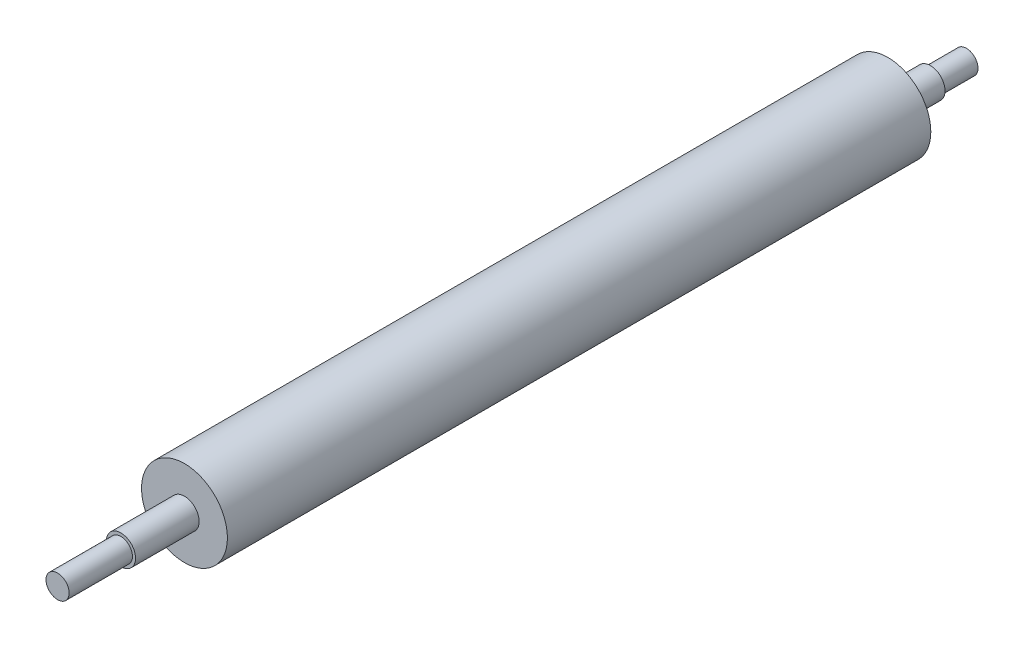
ISO-10303-21;
HEADER;
FILE_DESCRIPTION(('STEP AP214'),'2;1');
FILE_NAME('part.step','',(''),(''),'','','');
FILE_SCHEMA(('AUTOMOTIVE_DESIGN { 1 0 10303 214 1 1 1 1 }'));
ENDSEC;
DATA;
#1=APPLICATION_CONTEXT('core data for automotive mechanical design processes');
#2=APPLICATION_PROTOCOL_DEFINITION('international standard','automotive_design',2000,#1);
#3=PRODUCT_CONTEXT('',#1,'mechanical');
#4=PRODUCT('Part','Part','',(#3));
#5=PRODUCT_RELATED_PRODUCT_CATEGORY('part','',(#4));
#6=PRODUCT_DEFINITION_FORMATION('','',#4);
#7=PRODUCT_DEFINITION_CONTEXT('part definition',#1,'design');
#8=PRODUCT_DEFINITION('design','',#6,#7);
#9=PRODUCT_DEFINITION_SHAPE('','',#8);
#10=(LENGTH_UNIT() NAMED_UNIT(*) SI_UNIT(.MILLI.,.METRE.));
#11=(NAMED_UNIT(*) PLANE_ANGLE_UNIT() SI_UNIT($,.RADIAN.));
#12=(NAMED_UNIT(*) SI_UNIT($,.STERADIAN.) SOLID_ANGLE_UNIT());
#13=UNCERTAINTY_MEASURE_WITH_UNIT(LENGTH_MEASURE(1.E-05),#10,'distance_accuracy_value','');
#14=(GEOMETRIC_REPRESENTATION_CONTEXT(3) GLOBAL_UNCERTAINTY_ASSIGNED_CONTEXT((#13)) GLOBAL_UNIT_ASSIGNED_CONTEXT((#10,
#11,#12)) REPRESENTATION_CONTEXT('',''));
#15=CARTESIAN_POINT('',(0.,0.,0.));
#16=DIRECTION('',(0.,0.,1.));
#17=DIRECTION('',(1.,0.,0.));
#18=AXIS2_PLACEMENT_3D('',#15,#16,#17);
#19=CARTESIAN_POINT('',(0.,0.,240.));
#20=DIRECTION('',(0.,0.,-1.));
#21=DIRECTION('',(-1.,0.,0.));
#22=AXIS2_PLACEMENT_3D('',#19,#20,#21);
#23=CYLINDRICAL_SURFACE('',#22,14.65);
#24=CARTESIAN_POINT('',(0.,0.,240.));
#25=DIRECTION('',(0.,0.,1.));
#26=DIRECTION('',(1.,0.,0.));
#27=AXIS2_PLACEMENT_3D('',#24,#25,#26);
#28=CIRCLE('',#27,14.65);
#29=CARTESIAN_POINT('',(14.65,0.,240.));
#30=VERTEX_POINT('',#29);
#31=EDGE_CURVE('E45',#30,#30,#28,.T.);
#32=ORIENTED_EDGE('',*,*,#31,.F.);
#33=EDGE_LOOP('',(#32));
#34=FACE_BOUND('',#33,.T.);
#35=CARTESIAN_POINT('',(0.,0.,0.));
#36=DIRECTION('',(0.,0.,1.));
#37=DIRECTION('',(1.,0.,0.));
#38=AXIS2_PLACEMENT_3D('',#35,#36,#37);
#39=CIRCLE('',#38,14.65);
#40=CARTESIAN_POINT('',(14.65,0.,0.));
#41=VERTEX_POINT('',#40);
#42=EDGE_CURVE('E36',#41,#41,#39,.T.);
#43=ORIENTED_EDGE('',*,*,#42,.T.);
#44=EDGE_LOOP('',(#43));
#45=FACE_BOUND('',#44,.T.);
#46=ADVANCED_FACE('F33',(#34,#45),#23,.T.);
#47=CARTESIAN_POINT('',(0.,0.,240.));
#48=DIRECTION('',(0.,0.,1.));
#49=DIRECTION('',(1.,0.,0.));
#50=AXIS2_PLACEMENT_3D('',#47,#48,#49);
#51=PLANE('',#50);
#52=CARTESIAN_POINT('',(0.,0.,240.));
#53=DIRECTION('',(0.,0.,1.));
#54=DIRECTION('',(1.,0.,0.));
#55=AXIS2_PLACEMENT_3D('',#52,#53,#54);
#56=CIRCLE('',#55,5.);
#57=CARTESIAN_POINT('',(5.,0.,240.));
#58=VERTEX_POINT('',#57);
#59=EDGE_CURVE('E40',#58,#58,#56,.T.);
#60=ORIENTED_EDGE('',*,*,#59,.F.);
#61=EDGE_LOOP('',(#60));
#62=FACE_BOUND('',#61,.T.);
#63=ORIENTED_EDGE('',*,*,#31,.T.);
#64=EDGE_LOOP('',(#63));
#65=FACE_BOUND('',#64,.T.);
#66=ADVANCED_FACE('F74',(#62,#65),#51,.T.);
#67=CARTESIAN_POINT('',(0.,0.,0.));
#68=DIRECTION('',(0.,0.,1.));
#69=DIRECTION('',(1.,0.,0.));
#70=AXIS2_PLACEMENT_3D('',#67,#68,#69);
#71=PLANE('',#70);
#72=CARTESIAN_POINT('',(0.,0.,0.));
#73=DIRECTION('',(0.,0.,1.));
#74=DIRECTION('',(1.,0.,0.));
#75=AXIS2_PLACEMENT_3D('',#72,#73,#74);
#76=CIRCLE('',#75,5.);
#77=CARTESIAN_POINT('',(5.,0.,0.));
#78=VERTEX_POINT('',#77);
#79=EDGE_CURVE('E57',#78,#78,#76,.T.);
#80=ORIENTED_EDGE('',*,*,#79,.T.);
#81=EDGE_LOOP('',(#80));
#82=FACE_BOUND('',#81,.T.);
#83=ORIENTED_EDGE('',*,*,#42,.F.);
#84=EDGE_LOOP('',(#83));
#85=FACE_BOUND('',#84,.T.);
#86=ADVANCED_FACE('F71',(#82,#85),#71,.F.);
#87=CARTESIAN_POINT('',(0.,0.,-14.5));
#88=DIRECTION('',(0.,0.,1.));
#89=DIRECTION('',(1.,0.,0.));
#90=AXIS2_PLACEMENT_3D('',#87,#88,#89);
#91=CYLINDRICAL_SURFACE('',#90,5.);
#92=CARTESIAN_POINT('',(0.,0.,-14.5));
#93=DIRECTION('',(0.,0.,1.));
#94=DIRECTION('',(1.,0.,0.));
#95=AXIS2_PLACEMENT_3D('',#92,#93,#94);
#96=CIRCLE('',#95,5.);
#97=CARTESIAN_POINT('',(5.,0.,-14.5));
#98=VERTEX_POINT('',#97);
#99=EDGE_CURVE('E60',#98,#98,#96,.T.);
#100=CARTESIAN_POINT('',(5.,0.,-14.5));
#101=CARTESIAN_POINT('',(5.,0.,-14.3489583333333));
#102=CARTESIAN_POINT('',(5.,0.,-14.1979166666667));
#103=CARTESIAN_POINT('',(5.,0.,-13.8958333333333));
#104=CARTESIAN_POINT('',(5.,0.,-13.7447916666667));
#105=CARTESIAN_POINT('',(5.,0.,-13.4427083333333));
#106=CARTESIAN_POINT('',(5.,0.,-13.2916666666667));
#107=CARTESIAN_POINT('',(5.,0.,-12.9895833333333));
#108=CARTESIAN_POINT('',(5.,0.,-12.8385416666667));
#109=CARTESIAN_POINT('',(5.,0.,-12.5364583333333));
#110=CARTESIAN_POINT('',(5.,0.,-12.3854166666667));
#111=CARTESIAN_POINT('',(5.,0.,-12.0833333333333));
#112=CARTESIAN_POINT('',(5.,0.,-11.9322916666667));
#113=CARTESIAN_POINT('',(5.,0.,-11.6302083333333));
#114=CARTESIAN_POINT('',(5.,0.,-11.4791666666667));
#115=CARTESIAN_POINT('',(5.,0.,-11.1770833333333));
#116=CARTESIAN_POINT('',(5.,0.,-11.0260416666667));
#117=CARTESIAN_POINT('',(5.,0.,-10.7239583333333));
#118=CARTESIAN_POINT('',(5.,0.,-10.5729166666667));
#119=CARTESIAN_POINT('',(5.,0.,-10.2708333333333));
#120=CARTESIAN_POINT('',(5.,0.,-10.1197916666667));
#121=CARTESIAN_POINT('',(5.,0.,-9.81770833333333));
#122=CARTESIAN_POINT('',(5.,0.,-9.66666666666667));
#123=CARTESIAN_POINT('',(5.,0.,-9.36458333333333));
#124=CARTESIAN_POINT('',(5.,0.,-9.21354166666667));
#125=CARTESIAN_POINT('',(5.,0.,-8.91145833333334));
#126=CARTESIAN_POINT('',(5.,0.,-8.76041666666667));
#127=CARTESIAN_POINT('',(5.,0.,-8.45833333333334));
#128=CARTESIAN_POINT('',(5.,0.,-8.30729166666667));
#129=CARTESIAN_POINT('',(5.,0.,-8.00520833333333));
#130=CARTESIAN_POINT('',(5.,0.,-7.85416666666667));
#131=CARTESIAN_POINT('',(5.,0.,-7.55208333333333));
#132=CARTESIAN_POINT('',(5.,0.,-7.40104166666667));
#133=CARTESIAN_POINT('',(5.,0.,-7.09895833333333));
#134=CARTESIAN_POINT('',(5.,0.,-6.94791666666667));
#135=CARTESIAN_POINT('',(5.,0.,-6.64583333333333));
#136=CARTESIAN_POINT('',(5.,0.,-6.49479166666667));
#137=CARTESIAN_POINT('',(5.,0.,-6.19270833333333));
#138=CARTESIAN_POINT('',(5.,0.,-6.04166666666667));
#139=CARTESIAN_POINT('',(5.,0.,-5.73958333333333));
#140=CARTESIAN_POINT('',(5.,0.,-5.58854166666667));
#141=CARTESIAN_POINT('',(5.,0.,-5.28645833333333));
#142=CARTESIAN_POINT('',(5.,0.,-5.13541666666667));
#143=CARTESIAN_POINT('',(5.,0.,-4.83333333333333));
#144=CARTESIAN_POINT('',(5.,0.,-4.68229166666667));
#145=CARTESIAN_POINT('',(5.,0.,-4.38020833333333));
#146=CARTESIAN_POINT('',(5.,0.,-4.22916666666667));
#147=CARTESIAN_POINT('',(5.,0.,-3.92708333333333));
#148=CARTESIAN_POINT('',(5.,0.,-3.77604166666667));
#149=CARTESIAN_POINT('',(5.,0.,-3.47395833333333));
#150=CARTESIAN_POINT('',(5.,0.,-3.32291666666667));
#151=CARTESIAN_POINT('',(5.,0.,-3.02083333333333));
#152=CARTESIAN_POINT('',(5.,0.,-2.86979166666667));
#153=CARTESIAN_POINT('',(5.,0.,-2.56770833333333));
#154=CARTESIAN_POINT('',(5.,0.,-2.41666666666667));
#155=CARTESIAN_POINT('',(5.,0.,-2.11458333333333));
#156=CARTESIAN_POINT('',(5.,0.,-1.96354166666667));
#157=CARTESIAN_POINT('',(5.,0.,-1.66145833333333));
#158=CARTESIAN_POINT('',(5.,0.,-1.51041666666667));
#159=CARTESIAN_POINT('',(5.,0.,-1.20833333333333));
#160=CARTESIAN_POINT('',(5.,0.,-1.05729166666667));
#161=CARTESIAN_POINT('',(5.,0.,-0.755208333333334));
#162=CARTESIAN_POINT('',(5.,0.,-0.604166666666667));
#163=CARTESIAN_POINT('',(5.,0.,-0.302083333333333));
#164=CARTESIAN_POINT('',(5.,0.,-0.151041666666667));
#165=CARTESIAN_POINT('',(5.,0.,0.));
#166=B_SPLINE_CURVE_WITH_KNOTS('',3,(#100,#101,#102,#103,#104,#105,#106,#107,#108,#109,#110,
#111,#112,#113,#114,#115,#116,#117,#118,#119,#120,#121,#122,#123,#124,#125,#126,#127,#128,#129,
#130,#131,#132,#133,#134,#135,#136,#137,#138,#139,#140,#141,#142,#143,#144,#145,#146,#147,#148,
#149,#150,#151,#152,#153,#154,#155,#156,#157,#158,#159,#160,#161,#162,#163,#164,#165),
.UNSPECIFIED.,.F.,.F.,(4,2,2,2,2,2,2,2,2,2,2,2,2,2,2,2,2,2,2,2,2,2,2,2,2,2,2,2,2,2,2,2,4),(0.,
0.453124999999999,0.906249999999999,1.359375,1.8125,2.265625,2.71875,3.171875,3.625,4.078125,
4.53125,4.984375,5.4375,5.890625,6.34375,6.796875,7.25,7.703125,8.15625,8.609375,9.0625,
9.515625,9.96875,10.421875,10.875,11.328125,11.78125,12.234375,12.6875,13.140625,13.59375,
14.046875,14.5),.UNSPECIFIED.);
#167=EDGE_CURVE('BSEAM73',#98,#78,#166,.T.);
#168=ORIENTED_EDGE('',*,*,#99,.T.);
#169=ORIENTED_EDGE('',*,*,#79,.F.);
#170=ORIENTED_EDGE('',*,*,#167,.T.);
#171=ORIENTED_EDGE('',*,*,#167,.F.);
#172=EDGE_LOOP('',(#168,#170,#169,#171));
#173=FACE_BOUND('',#172,.T.);
#174=ADVANCED_FACE('F73',(#173),#91,.T.);
#175=CARTESIAN_POINT('',(0.,0.,-14.5));
#176=DIRECTION('',(0.,0.,1.));
#177=DIRECTION('',(1.,0.,0.));
#178=AXIS2_PLACEMENT_3D('',#175,#176,#177);
#179=PLANE('',#178);
#180=CARTESIAN_POINT('',(0.,0.,-14.5));
#181=DIRECTION('',(0.,0.,1.));
#182=DIRECTION('',(1.,0.,0.));
#183=AXIS2_PLACEMENT_3D('',#180,#181,#182);
#184=CIRCLE('',#183,3.95);
#185=CARTESIAN_POINT('',(3.95,0.,-14.5));
#186=VERTEX_POINT('',#185);
#187=EDGE_CURVE('E52',#186,#186,#184,.T.);
#188=ORIENTED_EDGE('',*,*,#187,.T.);
#189=EDGE_LOOP('',(#188));
#190=FACE_BOUND('',#189,.T.);
#191=ORIENTED_EDGE('',*,*,#99,.F.);
#192=EDGE_LOOP('',(#191));
#193=FACE_BOUND('',#192,.T.);
#194=ADVANCED_FACE('F80',(#190,#193),#179,.F.);
#195=CARTESIAN_POINT('',(0.,0.,-26.8));
#196=DIRECTION('',(0.,0.,1.));
#197=DIRECTION('',(1.,0.,0.));
#198=AXIS2_PLACEMENT_3D('',#195,#196,#197);
#199=CYLINDRICAL_SURFACE('',#198,3.95);
#200=CARTESIAN_POINT('',(0.,0.,-26.8));
#201=DIRECTION('',(0.,0.,1.));
#202=DIRECTION('',(1.,0.,0.));
#203=AXIS2_PLACEMENT_3D('',#200,#201,#202);
#204=CIRCLE('',#203,3.95);
#205=CARTESIAN_POINT('',(3.95,0.,-26.8));
#206=VERTEX_POINT('',#205);
#207=EDGE_CURVE('E54',#206,#206,#204,.T.);
#208=ORIENTED_EDGE('',*,*,#207,.T.);
#209=EDGE_LOOP('',(#208));
#210=FACE_BOUND('',#209,.T.);
#211=ORIENTED_EDGE('',*,*,#187,.F.);
#212=EDGE_LOOP('',(#211));
#213=FACE_BOUND('',#212,.T.);
#214=ADVANCED_FACE('F147',(#210,#213),#199,.T.);
#215=CARTESIAN_POINT('',(0.,0.,-26.8));
#216=DIRECTION('',(0.,0.,1.));
#217=DIRECTION('',(1.,0.,0.));
#218=AXIS2_PLACEMENT_3D('',#215,#216,#217);
#219=PLANE('',#218);
#220=ORIENTED_EDGE('',*,*,#207,.F.);
#221=EDGE_LOOP('',(#220));
#222=FACE_BOUND('',#221,.T.);
#223=ADVANCED_FACE('F100',(#222),#219,.F.);
#224=CARTESIAN_POINT('',(0.,0.,261.7));
#225=DIRECTION('',(0.,0.,-1.));
#226=DIRECTION('',(-1.,0.,0.));
#227=AXIS2_PLACEMENT_3D('',#224,#225,#226);
#228=CYLINDRICAL_SURFACE('',#227,5.);
#229=CARTESIAN_POINT('',(0.,0.,261.7));
#230=DIRECTION('',(0.,0.,1.));
#231=DIRECTION('',(1.,0.,0.));
#232=AXIS2_PLACEMENT_3D('',#229,#230,#231);
#233=CIRCLE('',#232,5.);
#234=CARTESIAN_POINT('',(5.,0.,261.7));
#235=VERTEX_POINT('',#234);
#236=EDGE_CURVE('E50',#235,#235,#233,.T.);
#237=ORIENTED_EDGE('',*,*,#236,.F.);
#238=EDGE_LOOP('',(#237));
#239=FACE_BOUND('',#238,.T.);
#240=ORIENTED_EDGE('',*,*,#59,.T.);
#241=EDGE_LOOP('',(#240));
#242=FACE_BOUND('',#241,.T.);
#243=ADVANCED_FACE('F105',(#239,#242),#228,.T.);
#244=CARTESIAN_POINT('',(0.,0.,261.7));
#245=DIRECTION('',(0.,0.,1.));
#246=DIRECTION('',(1.,0.,0.));
#247=AXIS2_PLACEMENT_3D('',#244,#245,#246);
#248=PLANE('',#247);
#249=CARTESIAN_POINT('',(0.,0.,261.7));
#250=DIRECTION('',(0.,0.,1.));
#251=DIRECTION('',(1.,0.,0.));
#252=AXIS2_PLACEMENT_3D('',#249,#250,#251);
#253=CIRCLE('',#252,3.95);
#254=CARTESIAN_POINT('',(-3.95,0.,261.7));
#255=VERTEX_POINT('',#254);
#256=EDGE_CURVE('E10',#255,#255,#253,.T.);
#257=ORIENTED_EDGE('',*,*,#256,.F.);
#258=EDGE_LOOP('',(#257));
#259=FACE_BOUND('',#258,.T.);
#260=ORIENTED_EDGE('',*,*,#236,.T.);
#261=EDGE_LOOP('',(#260));
#262=FACE_BOUND('',#261,.T.);
#263=ADVANCED_FACE('F110',(#259,#262),#248,.T.);
#264=CARTESIAN_POINT('',(0.,0.,283.3));
#265=DIRECTION('',(0.,0.,-1.));
#266=DIRECTION('',(-1.,0.,0.));
#267=AXIS2_PLACEMENT_3D('',#264,#265,#266);
#268=CYLINDRICAL_SURFACE('',#267,3.95);
#269=CARTESIAN_POINT('',(0.,0.,283.3));
#270=DIRECTION('',(0.,0.,1.));
#271=DIRECTION('',(1.,0.,0.));
#272=AXIS2_PLACEMENT_3D('',#269,#270,#271);
#273=CIRCLE('',#272,3.95);
#274=CARTESIAN_POINT('',(-3.95,0.,283.3));
#275=VERTEX_POINT('',#274);
#276=EDGE_CURVE('E49',#275,#275,#273,.T.);
#277=CARTESIAN_POINT('',(-3.95,0.,283.3));
#278=CARTESIAN_POINT('',(-3.95,0.,283.075));
#279=CARTESIAN_POINT('',(-3.95,0.,282.85));
#280=CARTESIAN_POINT('',(-3.95,0.,282.4));
#281=CARTESIAN_POINT('',(-3.95,0.,282.175));
#282=CARTESIAN_POINT('',(-3.95,0.,281.725));
#283=CARTESIAN_POINT('',(-3.95,0.,281.5));
#284=CARTESIAN_POINT('',(-3.95,0.,281.05));
#285=CARTESIAN_POINT('',(-3.95,0.,280.825));
#286=CARTESIAN_POINT('',(-3.95,0.,280.375));
#287=CARTESIAN_POINT('',(-3.95,0.,280.15));
#288=CARTESIAN_POINT('',(-3.95,0.,279.7));
#289=CARTESIAN_POINT('',(-3.95,0.,279.475));
#290=CARTESIAN_POINT('',(-3.95,0.,279.025));
#291=CARTESIAN_POINT('',(-3.95,0.,278.8));
#292=CARTESIAN_POINT('',(-3.95,0.,278.35));
#293=CARTESIAN_POINT('',(-3.95,0.,278.125));
#294=CARTESIAN_POINT('',(-3.95,0.,277.675));
#295=CARTESIAN_POINT('',(-3.95,0.,277.45));
#296=CARTESIAN_POINT('',(-3.95,0.,277.));
#297=CARTESIAN_POINT('',(-3.95,0.,276.775));
#298=CARTESIAN_POINT('',(-3.95,0.,276.325));
#299=CARTESIAN_POINT('',(-3.95,0.,276.1));
#300=CARTESIAN_POINT('',(-3.95,0.,275.65));
#301=CARTESIAN_POINT('',(-3.95,0.,275.425));
#302=CARTESIAN_POINT('',(-3.95,0.,274.975));
#303=CARTESIAN_POINT('',(-3.95,0.,274.75));
#304=CARTESIAN_POINT('',(-3.95,0.,274.3));
#305=CARTESIAN_POINT('',(-3.95,0.,274.075));
#306=CARTESIAN_POINT('',(-3.95,0.,273.625));
#307=CARTESIAN_POINT('',(-3.95,0.,273.4));
#308=CARTESIAN_POINT('',(-3.95,0.,272.95));
#309=CARTESIAN_POINT('',(-3.95,0.,272.725));
#310=CARTESIAN_POINT('',(-3.95,0.,272.275));
#311=CARTESIAN_POINT('',(-3.95,0.,272.05));
#312=CARTESIAN_POINT('',(-3.95,0.,271.6));
#313=CARTESIAN_POINT('',(-3.95,0.,271.375));
#314=CARTESIAN_POINT('',(-3.95,0.,270.925));
#315=CARTESIAN_POINT('',(-3.95,0.,270.7));
#316=CARTESIAN_POINT('',(-3.95,0.,270.25));
#317=CARTESIAN_POINT('',(-3.95,0.,270.025));
#318=CARTESIAN_POINT('',(-3.95,0.,269.575));
#319=CARTESIAN_POINT('',(-3.95,0.,269.35));
#320=CARTESIAN_POINT('',(-3.95,0.,268.9));
#321=CARTESIAN_POINT('',(-3.95,0.,268.675));
#322=CARTESIAN_POINT('',(-3.95,0.,268.225));
#323=CARTESIAN_POINT('',(-3.95,0.,268.));
#324=CARTESIAN_POINT('',(-3.95,0.,267.55));
#325=CARTESIAN_POINT('',(-3.95,0.,267.325));
#326=CARTESIAN_POINT('',(-3.95,0.,266.875));
#327=CARTESIAN_POINT('',(-3.95,0.,266.65));
#328=CARTESIAN_POINT('',(-3.95,0.,266.2));
#329=CARTESIAN_POINT('',(-3.95,0.,265.975));
#330=CARTESIAN_POINT('',(-3.95,0.,265.525));
#331=CARTESIAN_POINT('',(-3.95,0.,265.3));
#332=CARTESIAN_POINT('',(-3.95,0.,264.85));
#333=CARTESIAN_POINT('',(-3.95,0.,264.625));
#334=CARTESIAN_POINT('',(-3.95,0.,264.175));
#335=CARTESIAN_POINT('',(-3.95,0.,263.95));
#336=CARTESIAN_POINT('',(-3.95,0.,263.5));
#337=CARTESIAN_POINT('',(-3.95,0.,263.275));
#338=CARTESIAN_POINT('',(-3.95,0.,262.825));
#339=CARTESIAN_POINT('',(-3.95,0.,262.6));
#340=CARTESIAN_POINT('',(-3.95,0.,262.15));
#341=CARTESIAN_POINT('',(-3.95,0.,261.925));
#342=CARTESIAN_POINT('',(-3.95,0.,261.7));
#343=B_SPLINE_CURVE_WITH_KNOTS('',3,(#277,#278,#279,#280,#281,#282,#283,#284,#285,#286,#287,
#288,#289,#290,#291,#292,#293,#294,#295,#296,#297,#298,#299,#300,#301,#302,#303,#304,#305,#306,
#307,#308,#309,#310,#311,#312,#313,#314,#315,#316,#317,#318,#319,#320,#321,#322,#323,#324,#325,
#326,#327,#328,#329,#330,#331,#332,#333,#334,#335,#336,#337,#338,#339,#340,#341,#342),
.UNSPECIFIED.,.F.,.F.,(4,2,2,2,2,2,2,2,2,2,2,2,2,2,2,2,2,2,2,2,2,2,2,2,2,2,2,2,2,2,2,2,4),(0.,
0.675000000000037,1.35000000000002,2.02500000000005,2.70000000000004,3.37500000000002,
4.05000000000005,4.72500000000004,5.40000000000002,6.07500000000005,6.75000000000003,
7.42500000000001,8.10000000000005,8.77500000000003,9.45000000000001,10.125,10.8,11.475,
12.1500000000001,12.825,13.5,14.175,14.85,15.525,16.2,16.875,17.55,18.225,18.9,19.575,20.25,
20.925,21.6),.UNSPECIFIED.);
#344=EDGE_CURVE('BSEAM120',#275,#255,#343,.T.);
#345=ORIENTED_EDGE('',*,*,#276,.F.);
#346=ORIENTED_EDGE('',*,*,#256,.T.);
#347=ORIENTED_EDGE('',*,*,#344,.T.);
#348=ORIENTED_EDGE('',*,*,#344,.F.);
#349=EDGE_LOOP('',(#345,#347,#346,#348));
#350=FACE_BOUND('',#349,.T.);
#351=ADVANCED_FACE('F120',(#350),#268,.T.);
#352=CARTESIAN_POINT('',(0.,0.,283.3));
#353=DIRECTION('',(0.,0.,1.));
#354=DIRECTION('',(1.,0.,0.));
#355=AXIS2_PLACEMENT_3D('',#352,#353,#354);
#356=PLANE('',#355);
#357=ORIENTED_EDGE('',*,*,#276,.T.);
#358=EDGE_LOOP('',(#357));
#359=FACE_BOUND('',#358,.T.);
#360=ADVANCED_FACE('F130',(#359),#356,.T.);
#361=CLOSED_SHELL('',(#46,#66,#86,#174,#194,#214,#223,#243,#263,#351,#360));
#362=MANIFOLD_SOLID_BREP('B2',#361);
#363=ADVANCED_BREP_SHAPE_REPRESENTATION('',(#18,#362),#14);
#364=SHAPE_DEFINITION_REPRESENTATION(#9,#363);
ENDSEC;
END-ISO-10303-21;
